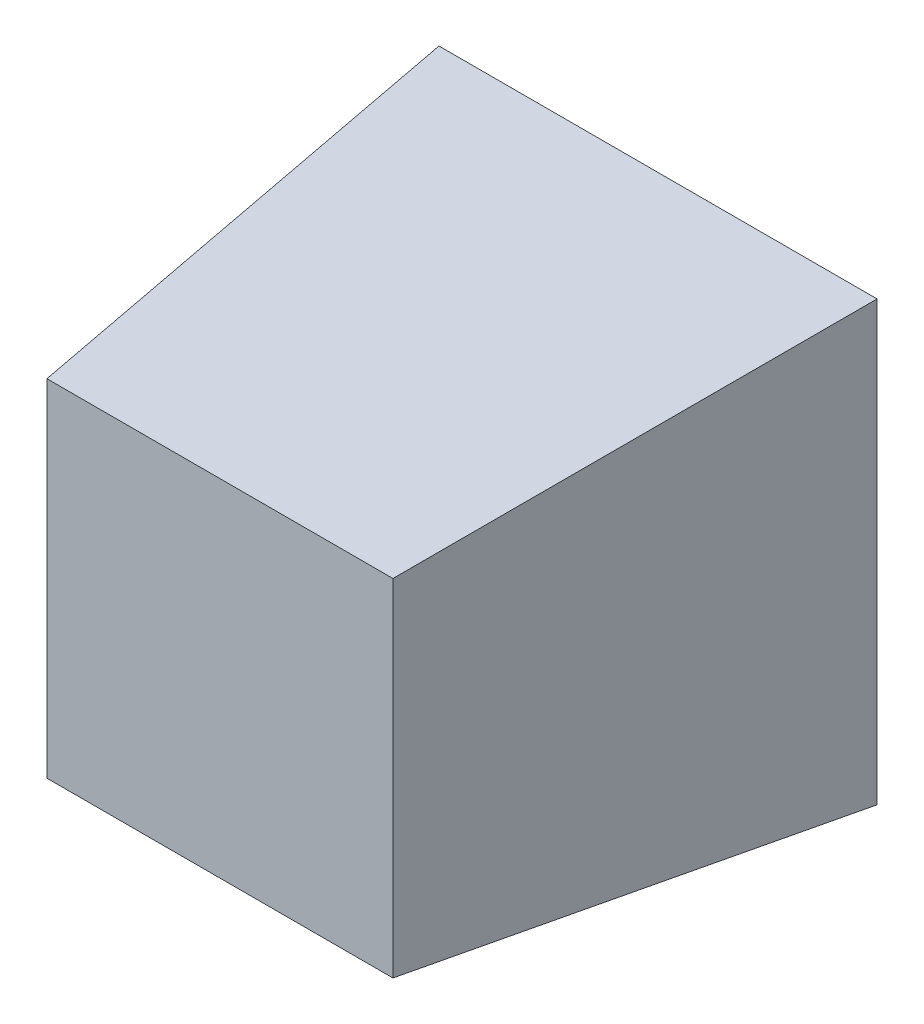
ISO-10303-21;
HEADER;
FILE_DESCRIPTION(('STEP AP214'),'2;1');
FILE_NAME('part.step','',(''),(''),'','','');
FILE_SCHEMA(('AUTOMOTIVE_DESIGN { 1 0 10303 214 1 1 1 1 }'));
ENDSEC;
DATA;
#1=APPLICATION_CONTEXT('core data for automotive mechanical design processes');
#2=APPLICATION_PROTOCOL_DEFINITION('international standard','automotive_design',2000,#1);
#3=PRODUCT_CONTEXT('',#1,'mechanical');
#4=PRODUCT('Part','Part','',(#3));
#5=PRODUCT_RELATED_PRODUCT_CATEGORY('part','',(#4));
#6=PRODUCT_DEFINITION_FORMATION('','',#4);
#7=PRODUCT_DEFINITION_CONTEXT('part definition',#1,'design');
#8=PRODUCT_DEFINITION('design','',#6,#7);
#9=PRODUCT_DEFINITION_SHAPE('','',#8);
#10=(LENGTH_UNIT() NAMED_UNIT(*) SI_UNIT(.MILLI.,.METRE.));
#11=(NAMED_UNIT(*) PLANE_ANGLE_UNIT() SI_UNIT($,.RADIAN.));
#12=(NAMED_UNIT(*) SI_UNIT($,.STERADIAN.) SOLID_ANGLE_UNIT());
#13=UNCERTAINTY_MEASURE_WITH_UNIT(LENGTH_MEASURE(1.E-05),#10,'distance_accuracy_value','');
#14=(GEOMETRIC_REPRESENTATION_CONTEXT(3) GLOBAL_UNCERTAINTY_ASSIGNED_CONTEXT((#13)) GLOBAL_UNIT_ASSIGNED_CONTEXT((#10,
#11,#12)) REPRESENTATION_CONTEXT('',''));
#15=CARTESIAN_POINT('',(0.,0.,0.));
#16=DIRECTION('',(0.,0.,1.));
#17=DIRECTION('',(1.,0.,0.));
#18=AXIS2_PLACEMENT_3D('',#15,#16,#17);
#19=CARTESIAN_POINT('',(0.,0.,0.));
#20=DIRECTION('',(-0.994521895368273,0.,0.104528463267653));
#21=DIRECTION('',(0.104528463267653,0.,0.994521895368273));
#22=AXIS2_PLACEMENT_3D('',#19,#20,#21);
#23=PLANE('',#22);
#24=DIRECTION('',(0.,-1.,0.));
#25=VECTOR('',#24,1.);
#26=CARTESIAN_POINT('',(0.,0.,0.));
#27=LINE('',#26,#25);
#28=CARTESIAN_POINT('',(0.,10.,0.));
#29=VERTEX_POINT('',#28);
#30=CARTESIAN_POINT('',(0.,0.,0.));
#31=VERTEX_POINT('',#30);
#32=EDGE_CURVE('E90',#29,#31,#27,.T.);
#33=ORIENTED_EDGE('',*,*,#32,.T.);
#34=DIRECTION('',(-0.103962051184498,-0.103962051184498,-0.989132844377854));
#35=VECTOR('',#34,1.);
#36=CARTESIAN_POINT('',(0.,0.,0.));
#37=LINE('',#36,#35);
#38=CARTESIAN_POINT('',(1.05104235265676,1.05104235265676,10.));
#39=VERTEX_POINT('',#38);
#40=EDGE_CURVE('E11',#39,#31,#37,.T.);
#41=ORIENTED_EDGE('',*,*,#40,.F.);
#42=DIRECTION('',(0.,1.,0.));
#43=VECTOR('',#42,1.);
#44=CARTESIAN_POINT('',(1.05104235265676,0.,10.));
#45=LINE('',#44,#43);
#46=CARTESIAN_POINT('',(1.05104235265676,8.94895764734324,10.));
#47=VERTEX_POINT('',#46);
#48=EDGE_CURVE('E104',#47,#39,#45,.F.);
#49=ORIENTED_EDGE('',*,*,#48,.F.);
#50=DIRECTION('',(-0.103962051184498,0.103962051184498,-0.989132844377854));
#51=VECTOR('',#50,1.);
#52=CARTESIAN_POINT('',(0.108081080864881,9.89191891913512,1.02832279395478));
#53=LINE('',#52,#51);
#54=EDGE_CURVE('E99',#47,#29,#53,.T.);
#55=ORIENTED_EDGE('',*,*,#54,.T.);
#56=EDGE_LOOP('',(#33,#41,#49,#55));
#57=FACE_BOUND('',#56,.T.);
#58=ADVANCED_FACE('F43',(#57),#23,.T.);
#59=CARTESIAN_POINT('',(0.,0.,0.));
#60=DIRECTION('',(0.,-0.994521895368273,0.104528463267653));
#61=DIRECTION('',(0.,0.104528463267653,0.994521895368273));
#62=AXIS2_PLACEMENT_3D('',#59,#60,#61);
#63=PLANE('',#62);
#64=DIRECTION('',(1.,0.,0.));
#65=VECTOR('',#64,1.);
#66=CARTESIAN_POINT('',(0.,0.,0.));
#67=LINE('',#66,#65);
#68=CARTESIAN_POINT('',(10.,0.,0.));
#69=VERTEX_POINT('',#68);
#70=EDGE_CURVE('E81',#31,#69,#67,.T.);
#71=ORIENTED_EDGE('',*,*,#70,.T.);
#72=DIRECTION('',(0.103962051184498,-0.103962051184498,-0.989132844377854));
#73=VECTOR('',#72,1.);
#74=CARTESIAN_POINT('',(10.,0.,0.));
#75=LINE('',#74,#73);
#76=CARTESIAN_POINT('',(8.94895764734324,1.05104235265676,10.));
#77=VERTEX_POINT('',#76);
#78=EDGE_CURVE('E55',#77,#69,#75,.T.);
#79=ORIENTED_EDGE('',*,*,#78,.F.);
#80=DIRECTION('',(-1.,0.,0.));
#81=VECTOR('',#80,1.);
#82=CARTESIAN_POINT('',(0.,1.05104235265676,10.));
#83=LINE('',#82,#81);
#84=EDGE_CURVE('E96',#39,#77,#83,.F.);
#85=ORIENTED_EDGE('',*,*,#84,.F.);
#86=ORIENTED_EDGE('',*,*,#40,.T.);
#87=EDGE_LOOP('',(#71,#79,#85,#86));
#88=FACE_BOUND('',#87,.T.);
#89=ADVANCED_FACE('F44',(#88),#63,.T.);
#90=CARTESIAN_POINT('',(10.,0.,0.));
#91=DIRECTION('',(0.994521895368273,0.,0.104528463267653));
#92=DIRECTION('',(-0.104528463267653,0.,0.994521895368273));
#93=AXIS2_PLACEMENT_3D('',#90,#91,#92);
#94=PLANE('',#93);
#95=DIRECTION('',(0.,1.,0.));
#96=VECTOR('',#95,1.);
#97=CARTESIAN_POINT('',(10.,0.,0.));
#98=LINE('',#97,#96);
#99=CARTESIAN_POINT('',(10.,10.,0.));
#100=VERTEX_POINT('',#99);
#101=EDGE_CURVE('E89',#69,#100,#98,.T.);
#102=ORIENTED_EDGE('',*,*,#101,.T.);
#103=DIRECTION('',(0.103962051184498,0.103962051184498,-0.989132844377854));
#104=VECTOR('',#103,1.);
#105=CARTESIAN_POINT('',(9.89191891913512,9.89191891913512,1.02832279395478));
#106=LINE('',#105,#104);
#107=CARTESIAN_POINT('',(8.94895764734324,8.94895764734324,10.));
#108=VERTEX_POINT('',#107);
#109=EDGE_CURVE('E107',#108,#100,#106,.T.);
#110=ORIENTED_EDGE('',*,*,#109,.F.);
#111=DIRECTION('',(0.,-1.,0.));
#112=VECTOR('',#111,1.);
#113=CARTESIAN_POINT('',(8.94895764734324,0.,10.));
#114=LINE('',#113,#112);
#115=EDGE_CURVE('E63',#77,#108,#114,.F.);
#116=ORIENTED_EDGE('',*,*,#115,.F.);
#117=ORIENTED_EDGE('',*,*,#78,.T.);
#118=EDGE_LOOP('',(#102,#110,#116,#117));
#119=FACE_BOUND('',#118,.T.);
#120=ADVANCED_FACE('F113',(#119),#94,.T.);
#121=CARTESIAN_POINT('',(0.,10.,0.));
#122=DIRECTION('',(0.,0.994521895368273,0.104528463267653));
#123=DIRECTION('',(0.,-0.104528463267653,0.994521895368273));
#124=AXIS2_PLACEMENT_3D('',#121,#122,#123);
#125=PLANE('',#124);
#126=DIRECTION('',(-1.,0.,0.));
#127=VECTOR('',#126,1.);
#128=CARTESIAN_POINT('',(0.,10.,0.));
#129=LINE('',#128,#127);
#130=EDGE_CURVE('E102',#100,#29,#129,.T.);
#131=ORIENTED_EDGE('',*,*,#130,.T.);
#132=ORIENTED_EDGE('',*,*,#54,.F.);
#133=DIRECTION('',(1.,0.,0.));
#134=VECTOR('',#133,1.);
#135=CARTESIAN_POINT('',(0.,8.94895764734324,10.));
#136=LINE('',#135,#134);
#137=EDGE_CURVE('E50',#108,#47,#136,.F.);
#138=ORIENTED_EDGE('',*,*,#137,.F.);
#139=ORIENTED_EDGE('',*,*,#109,.T.);
#140=EDGE_LOOP('',(#131,#132,#138,#139));
#141=FACE_BOUND('',#140,.T.);
#142=ADVANCED_FACE('F120',(#141),#125,.T.);
#143=CARTESIAN_POINT('',(0.,0.,10.));
#144=DIRECTION('',(0.,0.,-1.));
#145=DIRECTION('',(-1.,0.,0.));
#146=AXIS2_PLACEMENT_3D('',#143,#144,#145);
#147=PLANE('',#146);
#148=ORIENTED_EDGE('',*,*,#48,.T.);
#149=ORIENTED_EDGE('',*,*,#84,.T.);
#150=ORIENTED_EDGE('',*,*,#115,.T.);
#151=ORIENTED_EDGE('',*,*,#137,.T.);
#152=EDGE_LOOP('',(#148,#149,#150,#151));
#153=FACE_BOUND('',#152,.T.);
#154=ADVANCED_FACE('F114',(#153),#147,.F.);
#155=CARTESIAN_POINT('',(0.,0.,0.));
#156=DIRECTION('',(0.,0.,-1.));
#157=DIRECTION('',(-1.,0.,0.));
#158=AXIS2_PLACEMENT_3D('',#155,#156,#157);
#159=PLANE('',#158);
#160=ORIENTED_EDGE('',*,*,#32,.F.);
#161=ORIENTED_EDGE('',*,*,#130,.F.);
#162=ORIENTED_EDGE('',*,*,#101,.F.);
#163=ORIENTED_EDGE('',*,*,#70,.F.);
#164=EDGE_LOOP('',(#160,#161,#162,#163));
#165=FACE_BOUND('',#164,.T.);
#166=ADVANCED_FACE('F88',(#165),#159,.T.);
#167=CLOSED_SHELL('',(#58,#89,#120,#142,#154,#166));
#168=MANIFOLD_SOLID_BREP('B2',#167);
#169=ADVANCED_BREP_SHAPE_REPRESENTATION('',(#18,#168),#14);
#170=SHAPE_DEFINITION_REPRESENTATION(#9,#169);
ENDSEC;
END-ISO-10303-21;
